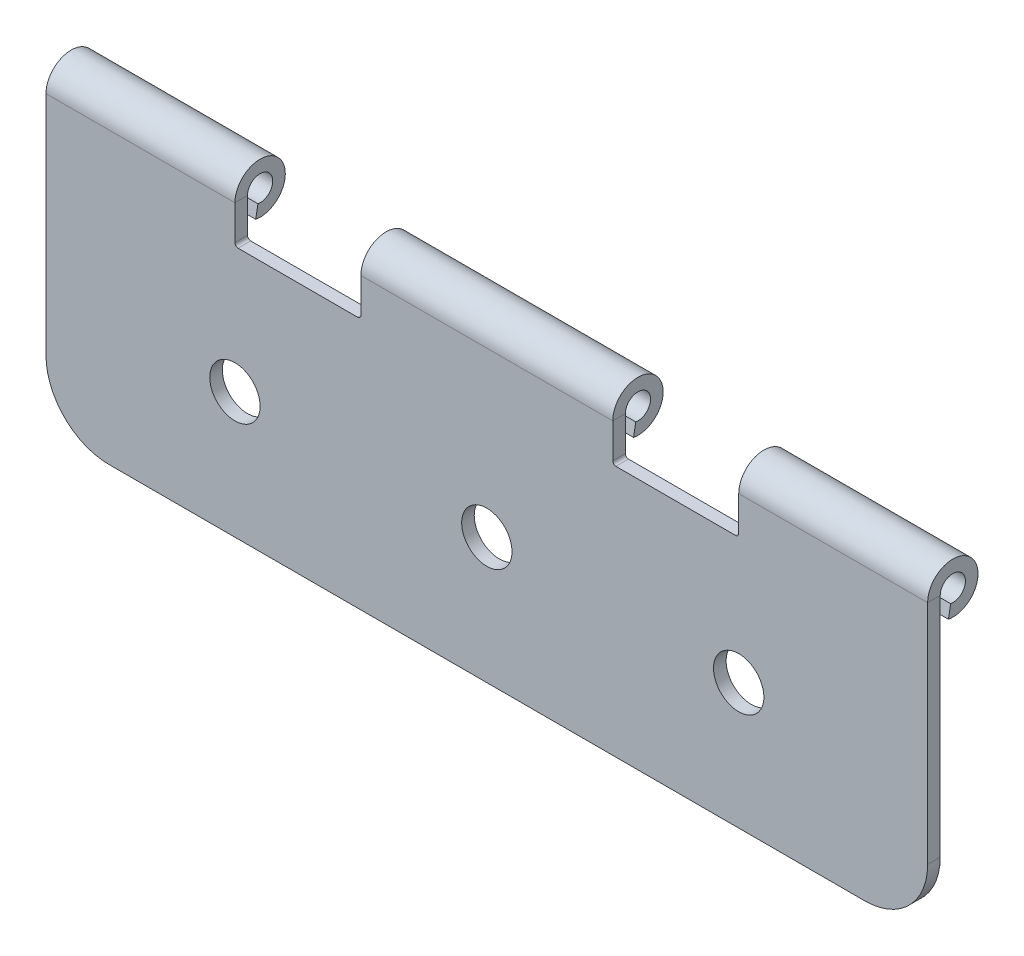
ISO-10303-21;
HEADER;
FILE_DESCRIPTION(('STEP AP214'),'2;1');
FILE_NAME('part.step','',(''),(''),'','','');
FILE_SCHEMA(('AUTOMOTIVE_DESIGN { 1 0 10303 214 1 1 1 1 }'));
ENDSEC;
DATA;
#1=APPLICATION_CONTEXT('core data for automotive mechanical design processes');
#2=APPLICATION_PROTOCOL_DEFINITION('international standard','automotive_design',2000,#1);
#3=PRODUCT_CONTEXT('',#1,'mechanical');
#4=PRODUCT('Part','Part','',(#3));
#5=PRODUCT_RELATED_PRODUCT_CATEGORY('part','',(#4));
#6=PRODUCT_DEFINITION_FORMATION('','',#4);
#7=PRODUCT_DEFINITION_CONTEXT('part definition',#1,'design');
#8=PRODUCT_DEFINITION('design','',#6,#7);
#9=PRODUCT_DEFINITION_SHAPE('','',#8);
#10=(LENGTH_UNIT() NAMED_UNIT(*) SI_UNIT(.MILLI.,.METRE.));
#11=(NAMED_UNIT(*) PLANE_ANGLE_UNIT() SI_UNIT($,.RADIAN.));
#12=(NAMED_UNIT(*) SI_UNIT($,.STERADIAN.) SOLID_ANGLE_UNIT());
#13=UNCERTAINTY_MEASURE_WITH_UNIT(LENGTH_MEASURE(1.E-05),#10,'distance_accuracy_value','');
#14=(GEOMETRIC_REPRESENTATION_CONTEXT(3) GLOBAL_UNCERTAINTY_ASSIGNED_CONTEXT((#13)) GLOBAL_UNIT_ASSIGNED_CONTEXT((#10,
#11,#12)) REPRESENTATION_CONTEXT('',''));
#15=CARTESIAN_POINT('',(0.,0.,0.));
#16=DIRECTION('',(0.,0.,1.));
#17=DIRECTION('',(1.,0.,0.));
#18=AXIS2_PLACEMENT_3D('',#15,#16,#17);
#19=CARTESIAN_POINT('',(15.,25.,-1.));
#20=DIRECTION('',(1.,0.,0.));
#21=DIRECTION('',(0.,0.,-1.));
#22=AXIS2_PLACEMENT_3D('',#19,#20,#21);
#23=PLANE('',#22);
#24=DIRECTION('',(0.,1.,0.));
#25=VECTOR('',#24,1.);
#26=CARTESIAN_POINT('',(15.,25.,0.));
#27=LINE('',#26,#25);
#28=CARTESIAN_POINT('',(15.,20.25,0.));
#29=VERTEX_POINT('',#28);
#30=CARTESIAN_POINT('',(15.,23.,0.));
#31=VERTEX_POINT('',#30);
#32=EDGE_CURVE('E207',#29,#31,#27,.T.);
#33=ORIENTED_EDGE('',*,*,#32,.F.);
#34=DIRECTION('',(0.,0.,1.));
#35=VECTOR('',#34,1.);
#36=CARTESIAN_POINT('',(15.,20.25,-1.));
#37=LINE('',#36,#35);
#38=CARTESIAN_POINT('',(15.,20.25,-1.));
#39=VERTEX_POINT('',#38);
#40=EDGE_CURVE('E396',#29,#39,#37,.F.);
#41=ORIENTED_EDGE('',*,*,#40,.T.);
#42=DIRECTION('',(0.,1.,0.));
#43=VECTOR('',#42,1.);
#44=CARTESIAN_POINT('',(15.,25.,-1.));
#45=LINE('',#44,#43);
#46=CARTESIAN_POINT('',(15.,23.,-1.));
#47=VERTEX_POINT('',#46);
#48=EDGE_CURVE('E342',#39,#47,#45,.T.);
#49=ORIENTED_EDGE('',*,*,#48,.T.);
#50=DIRECTION('',(0.,0.,1.));
#51=VECTOR('',#50,1.);
#52=CARTESIAN_POINT('',(15.,23.,-1.));
#53=LINE('',#52,#51);
#54=EDGE_CURVE('E229',#47,#31,#53,.T.);
#55=ORIENTED_EDGE('',*,*,#54,.T.);
#56=EDGE_LOOP('',(#33,#41,#49,#55));
#57=FACE_BOUND('',#56,.T.);
#58=ADVANCED_FACE('F36',(#57),#23,.T.);
#59=CARTESIAN_POINT('',(45.,25.,-1.));
#60=DIRECTION('',(1.,0.,0.));
#61=DIRECTION('',(0.,0.,-1.));
#62=AXIS2_PLACEMENT_3D('',#59,#60,#61);
#63=PLANE('',#62);
#64=DIRECTION('',(0.,1.,0.));
#65=VECTOR('',#64,1.);
#66=CARTESIAN_POINT('',(45.,25.,0.));
#67=LINE('',#66,#65);
#68=CARTESIAN_POINT('',(45.,20.25,0.));
#69=VERTEX_POINT('',#68);
#70=CARTESIAN_POINT('',(45.,23.,0.));
#71=VERTEX_POINT('',#70);
#72=EDGE_CURVE('E356',#69,#71,#67,.T.);
#73=ORIENTED_EDGE('',*,*,#72,.F.);
#74=DIRECTION('',(0.,0.,1.));
#75=VECTOR('',#74,1.);
#76=CARTESIAN_POINT('',(45.,20.25,-1.));
#77=LINE('',#76,#75);
#78=CARTESIAN_POINT('',(45.,20.25,-1.));
#79=VERTEX_POINT('',#78);
#80=EDGE_CURVE('E378',#69,#79,#77,.F.);
#81=ORIENTED_EDGE('',*,*,#80,.T.);
#82=DIRECTION('',(0.,1.,0.));
#83=VECTOR('',#82,1.);
#84=CARTESIAN_POINT('',(45.,25.,-1.));
#85=LINE('',#84,#83);
#86=CARTESIAN_POINT('',(45.,23.,-1.));
#87=VERTEX_POINT('',#86);
#88=EDGE_CURVE('E334',#79,#87,#85,.T.);
#89=ORIENTED_EDGE('',*,*,#88,.T.);
#90=DIRECTION('',(0.,0.,1.));
#91=VECTOR('',#90,1.);
#92=CARTESIAN_POINT('',(45.,23.,-1.));
#93=LINE('',#92,#91);
#94=EDGE_CURVE('E263',#87,#71,#93,.T.);
#95=ORIENTED_EDGE('',*,*,#94,.T.);
#96=EDGE_LOOP('',(#73,#81,#89,#95));
#97=FACE_BOUND('',#96,.T.);
#98=ADVANCED_FACE('F467',(#97),#63,.T.);
#99=CARTESIAN_POINT('',(70.,25.,-1.));
#100=DIRECTION('',(1.,0.,0.));
#101=DIRECTION('',(0.,0.,-1.));
#102=AXIS2_PLACEMENT_3D('',#99,#100,#101);
#103=PLANE('',#102);
#104=DIRECTION('',(0.,1.,0.));
#105=VECTOR('',#104,1.);
#106=CARTESIAN_POINT('',(70.,25.,0.));
#107=LINE('',#106,#105);
#108=CARTESIAN_POINT('',(70.,4.99999999999999,0.));
#109=VERTEX_POINT('',#108);
#110=CARTESIAN_POINT('',(70.,23.,0.));
#111=VERTEX_POINT('',#110);
#112=EDGE_CURVE('E348',#109,#111,#107,.T.);
#113=ORIENTED_EDGE('',*,*,#112,.F.);
#114=DIRECTION('',(0.,0.,1.));
#115=VECTOR('',#114,1.);
#116=CARTESIAN_POINT('',(70.,4.99999999999999,-1.));
#117=LINE('',#116,#115);
#118=CARTESIAN_POINT('',(70.,4.99999999999999,-1.));
#119=VERTEX_POINT('',#118);
#120=EDGE_CURVE('E59',#109,#119,#117,.F.);
#121=ORIENTED_EDGE('',*,*,#120,.T.);
#122=DIRECTION('',(0.,1.,0.));
#123=VECTOR('',#122,1.);
#124=CARTESIAN_POINT('',(70.,25.,-1.));
#125=LINE('',#124,#123);
#126=CARTESIAN_POINT('',(70.,23.,-0.999999999999994));
#127=VERTEX_POINT('',#126);
#128=EDGE_CURVE('E326',#119,#127,#125,.T.);
#129=ORIENTED_EDGE('',*,*,#128,.T.);
#130=DIRECTION('',(0.,0.,1.));
#131=VECTOR('',#130,1.);
#132=CARTESIAN_POINT('',(70.,23.,-0.999999999999994));
#133=LINE('',#132,#131);
#134=EDGE_CURVE('E297',#127,#111,#133,.T.);
#135=ORIENTED_EDGE('',*,*,#134,.T.);
#136=EDGE_LOOP('',(#113,#121,#129,#135));
#137=FACE_BOUND('',#136,.T.);
#138=ADVANCED_FACE('F429',(#137),#103,.T.);
#139=CARTESIAN_POINT('',(70.,0.,-1.));
#140=DIRECTION('',(0.,-1.,0.));
#141=DIRECTION('',(1.,0.,0.));
#142=AXIS2_PLACEMENT_3D('',#139,#140,#141);
#143=PLANE('',#142);
#144=DIRECTION('',(1.,0.,0.));
#145=VECTOR('',#144,1.);
#146=CARTESIAN_POINT('',(70.,0.,-1.));
#147=LINE('',#146,#145);
#148=CARTESIAN_POINT('',(5.,0.,-1.));
#149=VERTEX_POINT('',#148);
#150=CARTESIAN_POINT('',(65.,0.,-1.));
#151=VERTEX_POINT('',#150);
#152=EDGE_CURVE('E206',#149,#151,#147,.T.);
#153=ORIENTED_EDGE('',*,*,#152,.T.);
#154=DIRECTION('',(0.,0.,1.));
#155=VECTOR('',#154,1.);
#156=CARTESIAN_POINT('',(65.,0.,-1.));
#157=LINE('',#156,#155);
#158=CARTESIAN_POINT('',(65.,0.,0.));
#159=VERTEX_POINT('',#158);
#160=EDGE_CURVE('E411',#151,#159,#157,.T.);
#161=ORIENTED_EDGE('',*,*,#160,.T.);
#162=DIRECTION('',(1.,0.,0.));
#163=VECTOR('',#162,1.);
#164=CARTESIAN_POINT('',(70.,0.,0.));
#165=LINE('',#164,#163);
#166=CARTESIAN_POINT('',(5.,0.,0.));
#167=VERTEX_POINT('',#166);
#168=EDGE_CURVE('E321',#167,#159,#165,.T.);
#169=ORIENTED_EDGE('',*,*,#168,.F.);
#170=DIRECTION('',(0.,0.,1.));
#171=VECTOR('',#170,1.);
#172=CARTESIAN_POINT('',(5.,0.,-1.));
#173=LINE('',#172,#171);
#174=EDGE_CURVE('E409',#167,#149,#173,.F.);
#175=ORIENTED_EDGE('',*,*,#174,.T.);
#176=EDGE_LOOP('',(#153,#161,#169,#175));
#177=FACE_BOUND('',#176,.T.);
#178=ADVANCED_FACE('F425',(#177),#143,.T.);
#179=CARTESIAN_POINT('',(0.,0.,-1.));
#180=DIRECTION('',(-1.,0.,0.));
#181=DIRECTION('',(0.,0.,1.));
#182=AXIS2_PLACEMENT_3D('',#179,#180,#181);
#183=PLANE('',#182);
#184=DIRECTION('',(0.,-1.,0.));
#185=VECTOR('',#184,1.);
#186=CARTESIAN_POINT('',(0.,0.,-1.));
#187=LINE('',#186,#185);
#188=CARTESIAN_POINT('',(0.,23.,-1.));
#189=VERTEX_POINT('',#188);
#190=CARTESIAN_POINT('',(0.,5.,-1.));
#191=VERTEX_POINT('',#190);
#192=EDGE_CURVE('E344',#189,#191,#187,.T.);
#193=ORIENTED_EDGE('',*,*,#192,.T.);
#194=DIRECTION('',(0.,0.,1.));
#195=VECTOR('',#194,1.);
#196=CARTESIAN_POINT('',(0.,5.,-1.));
#197=LINE('',#196,#195);
#198=CARTESIAN_POINT('',(0.,5.,0.));
#199=VERTEX_POINT('',#198);
#200=EDGE_CURVE('E11',#191,#199,#197,.T.);
#201=ORIENTED_EDGE('',*,*,#200,.T.);
#202=DIRECTION('',(0.,-1.,0.));
#203=VECTOR('',#202,1.);
#204=CARTESIAN_POINT('',(0.,0.,0.));
#205=LINE('',#204,#203);
#206=CARTESIAN_POINT('',(0.,23.,0.));
#207=VERTEX_POINT('',#206);
#208=EDGE_CURVE('E199',#207,#199,#205,.T.);
#209=ORIENTED_EDGE('',*,*,#208,.F.);
#210=DIRECTION('',(0.,0.,1.));
#211=VECTOR('',#210,1.);
#212=CARTESIAN_POINT('',(0.,23.,-1.));
#213=LINE('',#212,#211);
#214=EDGE_CURVE('E203',#189,#207,#213,.T.);
#215=ORIENTED_EDGE('',*,*,#214,.F.);
#216=EDGE_LOOP('',(#193,#201,#209,#215));
#217=FACE_BOUND('',#216,.T.);
#218=ADVANCED_FACE('F201',(#217),#183,.T.);
#219=CARTESIAN_POINT('',(15.,20.,-1.));
#220=DIRECTION('',(0.,1.,0.));
#221=DIRECTION('',(0.,0.,1.));
#222=AXIS2_PLACEMENT_3D('',#219,#220,#221);
#223=PLANE('',#222);
#224=DIRECTION('',(-1.,0.,0.));
#225=VECTOR('',#224,1.);
#226=CARTESIAN_POINT('',(15.,20.,-1.));
#227=LINE('',#226,#225);
#228=CARTESIAN_POINT('',(24.75,20.,-1.));
#229=VERTEX_POINT('',#228);
#230=CARTESIAN_POINT('',(15.25,20.,-1.));
#231=VERTEX_POINT('',#230);
#232=EDGE_CURVE('E339',#229,#231,#227,.T.);
#233=ORIENTED_EDGE('',*,*,#232,.T.);
#234=DIRECTION('',(0.,0.,1.));
#235=VECTOR('',#234,1.);
#236=CARTESIAN_POINT('',(15.25,20.,0.));
#237=LINE('',#236,#235);
#238=CARTESIAN_POINT('',(15.25,20.,0.));
#239=VERTEX_POINT('',#238);
#240=EDGE_CURVE('E393',#231,#239,#237,.T.);
#241=ORIENTED_EDGE('',*,*,#240,.T.);
#242=DIRECTION('',(-1.,0.,0.));
#243=VECTOR('',#242,1.);
#244=CARTESIAN_POINT('',(15.,20.,0.));
#245=LINE('',#244,#243);
#246=CARTESIAN_POINT('',(24.75,20.,0.));
#247=VERTEX_POINT('',#246);
#248=EDGE_CURVE('E361',#247,#239,#245,.T.);
#249=ORIENTED_EDGE('',*,*,#248,.F.);
#250=DIRECTION('',(0.,0.,1.));
#251=VECTOR('',#250,1.);
#252=CARTESIAN_POINT('',(24.75,20.,-1.));
#253=LINE('',#252,#251);
#254=EDGE_CURVE('E391',#247,#229,#253,.F.);
#255=ORIENTED_EDGE('',*,*,#254,.T.);
#256=EDGE_LOOP('',(#233,#241,#249,#255));
#257=FACE_BOUND('',#256,.T.);
#258=ADVANCED_FACE('F499',(#257),#223,.T.);
#259=CARTESIAN_POINT('',(25.,20.,-1.));
#260=DIRECTION('',(-1.,0.,0.));
#261=DIRECTION('',(0.,0.,1.));
#262=AXIS2_PLACEMENT_3D('',#259,#260,#261);
#263=PLANE('',#262);
#264=DIRECTION('',(0.,-1.,0.));
#265=VECTOR('',#264,1.);
#266=CARTESIAN_POINT('',(25.,20.,-1.));
#267=LINE('',#266,#265);
#268=CARTESIAN_POINT('',(25.,23.,-1.));
#269=VERTEX_POINT('',#268);
#270=CARTESIAN_POINT('',(25.,20.25,-1.));
#271=VERTEX_POINT('',#270);
#272=EDGE_CURVE('E336',#269,#271,#267,.T.);
#273=ORIENTED_EDGE('',*,*,#272,.T.);
#274=DIRECTION('',(0.,0.,1.));
#275=VECTOR('',#274,1.);
#276=CARTESIAN_POINT('',(25.,20.25,0.));
#277=LINE('',#276,#275);
#278=CARTESIAN_POINT('',(25.,20.25,0.));
#279=VERTEX_POINT('',#278);
#280=EDGE_CURVE('E398',#271,#279,#277,.T.);
#281=ORIENTED_EDGE('',*,*,#280,.T.);
#282=DIRECTION('',(0.,-1.,0.));
#283=VECTOR('',#282,1.);
#284=CARTESIAN_POINT('',(25.,20.,0.));
#285=LINE('',#284,#283);
#286=CARTESIAN_POINT('',(25.,23.,0.));
#287=VERTEX_POINT('',#286);
#288=EDGE_CURVE('E358',#287,#279,#285,.T.);
#289=ORIENTED_EDGE('',*,*,#288,.F.);
#290=DIRECTION('',(0.,0.,1.));
#291=VECTOR('',#290,1.);
#292=CARTESIAN_POINT('',(25.,23.,-1.));
#293=LINE('',#292,#291);
#294=EDGE_CURVE('E280',#269,#287,#293,.T.);
#295=ORIENTED_EDGE('',*,*,#294,.F.);
#296=EDGE_LOOP('',(#273,#281,#289,#295));
#297=FACE_BOUND('',#296,.T.);
#298=ADVANCED_FACE('F490',(#297),#263,.T.);
#299=CARTESIAN_POINT('',(45.,20.,-1.));
#300=DIRECTION('',(0.,1.,0.));
#301=DIRECTION('',(0.,0.,1.));
#302=AXIS2_PLACEMENT_3D('',#299,#300,#301);
#303=PLANE('',#302);
#304=DIRECTION('',(-1.,0.,0.));
#305=VECTOR('',#304,1.);
#306=CARTESIAN_POINT('',(45.,20.,-1.));
#307=LINE('',#306,#305);
#308=CARTESIAN_POINT('',(54.75,20.,-1.));
#309=VERTEX_POINT('',#308);
#310=CARTESIAN_POINT('',(45.25,20.,-1.));
#311=VERTEX_POINT('',#310);
#312=EDGE_CURVE('E331',#309,#311,#307,.T.);
#313=ORIENTED_EDGE('',*,*,#312,.T.);
#314=DIRECTION('',(0.,0.,1.));
#315=VECTOR('',#314,1.);
#316=CARTESIAN_POINT('',(45.25,20.,0.));
#317=LINE('',#316,#315);
#318=CARTESIAN_POINT('',(45.25,20.,0.));
#319=VERTEX_POINT('',#318);
#320=EDGE_CURVE('E375',#311,#319,#317,.T.);
#321=ORIENTED_EDGE('',*,*,#320,.T.);
#322=DIRECTION('',(-1.,0.,0.));
#323=VECTOR('',#322,1.);
#324=CARTESIAN_POINT('',(45.,20.,0.));
#325=LINE('',#324,#323);
#326=CARTESIAN_POINT('',(54.75,20.,0.));
#327=VERTEX_POINT('',#326);
#328=EDGE_CURVE('E353',#327,#319,#325,.T.);
#329=ORIENTED_EDGE('',*,*,#328,.F.);
#330=DIRECTION('',(0.,0.,1.));
#331=VECTOR('',#330,1.);
#332=CARTESIAN_POINT('',(54.75,20.,-1.));
#333=LINE('',#332,#331);
#334=EDGE_CURVE('E346',#327,#309,#333,.F.);
#335=ORIENTED_EDGE('',*,*,#334,.T.);
#336=EDGE_LOOP('',(#313,#321,#329,#335));
#337=FACE_BOUND('',#336,.T.);
#338=ADVANCED_FACE('F459',(#337),#303,.T.);
#339=CARTESIAN_POINT('',(55.,20.,-1.));
#340=DIRECTION('',(-1.,0.,0.));
#341=DIRECTION('',(0.,-1.,0.));
#342=AXIS2_PLACEMENT_3D('',#339,#340,#341);
#343=PLANE('',#342);
#344=DIRECTION('',(0.,-1.,0.));
#345=VECTOR('',#344,1.);
#346=CARTESIAN_POINT('',(55.,20.,-1.));
#347=LINE('',#346,#345);
#348=CARTESIAN_POINT('',(55.,23.,-0.999999999999994));
#349=VERTEX_POINT('',#348);
#350=CARTESIAN_POINT('',(55.,20.25,-1.));
#351=VERTEX_POINT('',#350);
#352=EDGE_CURVE('E328',#349,#351,#347,.T.);
#353=ORIENTED_EDGE('',*,*,#352,.T.);
#354=DIRECTION('',(0.,0.,1.));
#355=VECTOR('',#354,1.);
#356=CARTESIAN_POINT('',(55.,20.25,0.));
#357=LINE('',#356,#355);
#358=CARTESIAN_POINT('',(55.,20.25,0.));
#359=VERTEX_POINT('',#358);
#360=EDGE_CURVE('E380',#351,#359,#357,.T.);
#361=ORIENTED_EDGE('',*,*,#360,.T.);
#362=DIRECTION('',(0.,-1.,0.));
#363=VECTOR('',#362,1.);
#364=CARTESIAN_POINT('',(55.,20.,0.));
#365=LINE('',#364,#363);
#366=CARTESIAN_POINT('',(55.,23.,0.));
#367=VERTEX_POINT('',#366);
#368=EDGE_CURVE('E350',#367,#359,#365,.T.);
#369=ORIENTED_EDGE('',*,*,#368,.F.);
#370=DIRECTION('',(0.,0.,1.));
#371=VECTOR('',#370,1.);
#372=CARTESIAN_POINT('',(55.,23.,-0.999999999999994));
#373=LINE('',#372,#371);
#374=EDGE_CURVE('E314',#349,#367,#373,.T.);
#375=ORIENTED_EDGE('',*,*,#374,.F.);
#376=EDGE_LOOP('',(#353,#361,#369,#375));
#377=FACE_BOUND('',#376,.T.);
#378=ADVANCED_FACE('F450',(#377),#343,.T.);
#379=CARTESIAN_POINT('',(0.,0.,-1.));
#380=DIRECTION('',(0.,0.,-1.));
#381=DIRECTION('',(-1.,0.,0.));
#382=AXIS2_PLACEMENT_3D('',#379,#380,#381);
#383=PLANE('',#382);
#384=CARTESIAN_POINT('',(15.,9.99999999999999,-1.));
#385=DIRECTION('',(0.,0.,-1.));
#386=DIRECTION('',(-1.,0.,0.));
#387=AXIS2_PLACEMENT_3D('',#384,#385,#386);
#388=CIRCLE('',#387,2.);
#389=CARTESIAN_POINT('',(13.,9.99999999999999,-1.));
#390=VERTEX_POINT('',#389);
#391=EDGE_CURVE('E865',#390,#390,#388,.T.);
#392=ORIENTED_EDGE('',*,*,#391,.F.);
#393=EDGE_LOOP('',(#392));
#394=FACE_BOUND('',#393,.T.);
#395=CARTESIAN_POINT('',(55.,10.,-1.));
#396=DIRECTION('',(0.,0.,-1.));
#397=DIRECTION('',(-1.,0.,0.));
#398=AXIS2_PLACEMENT_3D('',#395,#396,#397);
#399=CIRCLE('',#398,2.);
#400=CARTESIAN_POINT('',(53.,10.,-1.));
#401=VERTEX_POINT('',#400);
#402=EDGE_CURVE('E863',#401,#401,#399,.T.);
#403=ORIENTED_EDGE('',*,*,#402,.F.);
#404=EDGE_LOOP('',(#403));
#405=FACE_BOUND('',#404,.T.);
#406=CARTESIAN_POINT('',(35.,9.99999999999999,-1.));
#407=DIRECTION('',(0.,0.,-1.));
#408=DIRECTION('',(-1.,0.,0.));
#409=AXIS2_PLACEMENT_3D('',#406,#407,#408);
#410=CIRCLE('',#409,2.);
#411=CARTESIAN_POINT('',(33.,9.99999999999999,-1.));
#412=VERTEX_POINT('',#411);
#413=EDGE_CURVE('E369',#412,#412,#410,.T.);
#414=ORIENTED_EDGE('',*,*,#413,.F.);
#415=EDGE_LOOP('',(#414));
#416=FACE_BOUND('',#415,.T.);
#417=ORIENTED_EDGE('',*,*,#128,.F.);
#418=CARTESIAN_POINT('',(65.,4.99999999999999,-1.));
#419=DIRECTION('',(0.,0.,-1.));
#420=DIRECTION('',(-1.,0.,0.));
#421=AXIS2_PLACEMENT_3D('',#418,#419,#420);
#422=CIRCLE('',#421,5.);
#423=EDGE_CURVE('E44',#119,#151,#422,.T.);
#424=ORIENTED_EDGE('',*,*,#423,.T.);
#425=ORIENTED_EDGE('',*,*,#152,.F.);
#426=CARTESIAN_POINT('',(5.,5.,-1.));
#427=DIRECTION('',(0.,0.,-1.));
#428=DIRECTION('',(-1.,0.,0.));
#429=AXIS2_PLACEMENT_3D('',#426,#427,#428);
#430=CIRCLE('',#429,5.);
#431=EDGE_CURVE('E51',#149,#191,#430,.T.);
#432=ORIENTED_EDGE('',*,*,#431,.T.);
#433=ORIENTED_EDGE('',*,*,#192,.F.);
#434=DIRECTION('',(1.,0.,0.));
#435=VECTOR('',#434,1.);
#436=CARTESIAN_POINT('',(15.,23.,-1.));
#437=LINE('',#436,#435);
#438=EDGE_CURVE('E242',#47,#189,#437,.F.);
#439=ORIENTED_EDGE('',*,*,#438,.F.);
#440=ORIENTED_EDGE('',*,*,#48,.F.);
#441=CARTESIAN_POINT('',(15.25,20.25,-1.));
#442=DIRECTION('',(0.,0.,-1.));
#443=DIRECTION('',(-1.,0.,0.));
#444=AXIS2_PLACEMENT_3D('',#441,#442,#443);
#445=CIRCLE('',#444,0.25);
#446=EDGE_CURVE('E403',#39,#231,#445,.F.);
#447=ORIENTED_EDGE('',*,*,#446,.T.);
#448=ORIENTED_EDGE('',*,*,#232,.F.);
#449=CARTESIAN_POINT('',(24.75,20.25,-1.));
#450=DIRECTION('',(0.,0.,-1.));
#451=DIRECTION('',(-1.,0.,0.));
#452=AXIS2_PLACEMENT_3D('',#449,#450,#451);
#453=CIRCLE('',#452,0.25);
#454=EDGE_CURVE('E407',#229,#271,#453,.F.);
#455=ORIENTED_EDGE('',*,*,#454,.T.);
#456=ORIENTED_EDGE('',*,*,#272,.F.);
#457=DIRECTION('',(1.,0.,0.));
#458=VECTOR('',#457,1.);
#459=CARTESIAN_POINT('',(45.,23.,-1.));
#460=LINE('',#459,#458);
#461=EDGE_CURVE('E272',#87,#269,#460,.F.);
#462=ORIENTED_EDGE('',*,*,#461,.F.);
#463=ORIENTED_EDGE('',*,*,#88,.F.);
#464=CARTESIAN_POINT('',(45.25,20.25,-1.));
#465=DIRECTION('',(0.,0.,-1.));
#466=DIRECTION('',(-1.,0.,0.));
#467=AXIS2_PLACEMENT_3D('',#464,#465,#466);
#468=CIRCLE('',#467,0.25);
#469=EDGE_CURVE('E385',#79,#311,#468,.F.);
#470=ORIENTED_EDGE('',*,*,#469,.T.);
#471=ORIENTED_EDGE('',*,*,#312,.F.);
#472=CARTESIAN_POINT('',(54.75,20.25,-1.));
#473=DIRECTION('',(0.,0.,-1.));
#474=DIRECTION('',(-1.,0.,0.));
#475=AXIS2_PLACEMENT_3D('',#472,#473,#474);
#476=CIRCLE('',#475,0.25);
#477=EDGE_CURVE('E389',#309,#351,#476,.F.);
#478=ORIENTED_EDGE('',*,*,#477,.T.);
#479=ORIENTED_EDGE('',*,*,#352,.F.);
#480=DIRECTION('',(1.,0.,0.));
#481=VECTOR('',#480,1.);
#482=CARTESIAN_POINT('',(70.,23.,-0.999999999999994));
#483=LINE('',#482,#481);
#484=EDGE_CURVE('E306',#127,#349,#483,.F.);
#485=ORIENTED_EDGE('',*,*,#484,.F.);
#486=EDGE_LOOP('',(#417,#424,#425,#432,#433,#439,#440,#447,#448,#455,#456,#462,#463,#470,#471,
#478,#479,#485));
#487=FACE_BOUND('',#486,.T.);
#488=ADVANCED_FACE('F420',(#394,#405,#416,#487),#383,.T.);
#489=CARTESIAN_POINT('',(0.,0.,0.));
#490=DIRECTION('',(0.,0.,-1.));
#491=DIRECTION('',(-1.,0.,0.));
#492=AXIS2_PLACEMENT_3D('',#489,#490,#491);
#493=PLANE('',#492);
#494=CARTESIAN_POINT('',(15.,9.99999999999999,0.));
#495=DIRECTION('',(0.,0.,-1.));
#496=DIRECTION('',(-1.,0.,0.));
#497=AXIS2_PLACEMENT_3D('',#494,#495,#496);
#498=CIRCLE('',#497,2.);
#499=CARTESIAN_POINT('',(13.,9.99999999999999,0.));
#500=VERTEX_POINT('',#499);
#501=EDGE_CURVE('E250',#500,#500,#498,.T.);
#502=ORIENTED_EDGE('',*,*,#501,.T.);
#503=EDGE_LOOP('',(#502));
#504=FACE_BOUND('',#503,.T.);
#505=CARTESIAN_POINT('',(55.,10.,0.));
#506=DIRECTION('',(0.,0.,-1.));
#507=DIRECTION('',(-1.,0.,0.));
#508=AXIS2_PLACEMENT_3D('',#505,#506,#507);
#509=CIRCLE('',#508,2.);
#510=CARTESIAN_POINT('',(53.,10.,0.));
#511=VERTEX_POINT('',#510);
#512=EDGE_CURVE('E368',#511,#511,#509,.T.);
#513=ORIENTED_EDGE('',*,*,#512,.T.);
#514=EDGE_LOOP('',(#513));
#515=FACE_BOUND('',#514,.T.);
#516=CARTESIAN_POINT('',(35.,9.99999999999999,0.));
#517=DIRECTION('',(0.,0.,-1.));
#518=DIRECTION('',(-1.,0.,0.));
#519=AXIS2_PLACEMENT_3D('',#516,#517,#518);
#520=CIRCLE('',#519,2.);
#521=CARTESIAN_POINT('',(33.,9.99999999999999,0.));
#522=VERTEX_POINT('',#521);
#523=EDGE_CURVE('E365',#522,#522,#520,.T.);
#524=ORIENTED_EDGE('',*,*,#523,.T.);
#525=EDGE_LOOP('',(#524));
#526=FACE_BOUND('',#525,.T.);
#527=ORIENTED_EDGE('',*,*,#168,.T.);
#528=CARTESIAN_POINT('',(65.,4.99999999999999,0.));
#529=DIRECTION('',(0.,0.,-1.));
#530=DIRECTION('',(-1.,0.,0.));
#531=AXIS2_PLACEMENT_3D('',#528,#529,#530);
#532=CIRCLE('',#531,5.);
#533=EDGE_CURVE('E416',#159,#109,#532,.F.);
#534=ORIENTED_EDGE('',*,*,#533,.T.);
#535=ORIENTED_EDGE('',*,*,#112,.T.);
#536=DIRECTION('',(1.,0.,0.));
#537=VECTOR('',#536,1.);
#538=CARTESIAN_POINT('',(70.,23.,0.));
#539=LINE('',#538,#537);
#540=EDGE_CURVE('E290',#111,#367,#539,.F.);
#541=ORIENTED_EDGE('',*,*,#540,.T.);
#542=ORIENTED_EDGE('',*,*,#368,.T.);
#543=CARTESIAN_POINT('',(54.75,20.25,0.));
#544=DIRECTION('',(0.,0.,-1.));
#545=DIRECTION('',(-1.,0.,0.));
#546=AXIS2_PLACEMENT_3D('',#543,#544,#545);
#547=CIRCLE('',#546,0.25);
#548=EDGE_CURVE('E387',#359,#327,#547,.T.);
#549=ORIENTED_EDGE('',*,*,#548,.T.);
#550=ORIENTED_EDGE('',*,*,#328,.T.);
#551=CARTESIAN_POINT('',(45.25,20.25,0.));
#552=DIRECTION('',(0.,0.,-1.));
#553=DIRECTION('',(-1.,0.,0.));
#554=AXIS2_PLACEMENT_3D('',#551,#552,#553);
#555=CIRCLE('',#554,0.25);
#556=EDGE_CURVE('E383',#319,#69,#555,.T.);
#557=ORIENTED_EDGE('',*,*,#556,.T.);
#558=ORIENTED_EDGE('',*,*,#72,.T.);
#559=DIRECTION('',(1.,0.,0.));
#560=VECTOR('',#559,1.);
#561=CARTESIAN_POINT('',(45.,23.,0.));
#562=LINE('',#561,#560);
#563=EDGE_CURVE('E256',#71,#287,#562,.F.);
#564=ORIENTED_EDGE('',*,*,#563,.T.);
#565=ORIENTED_EDGE('',*,*,#288,.T.);
#566=CARTESIAN_POINT('',(24.75,20.25,0.));
#567=DIRECTION('',(0.,0.,-1.));
#568=DIRECTION('',(-1.,0.,0.));
#569=AXIS2_PLACEMENT_3D('',#566,#567,#568);
#570=CIRCLE('',#569,0.25);
#571=EDGE_CURVE('E405',#279,#247,#570,.T.);
#572=ORIENTED_EDGE('',*,*,#571,.T.);
#573=ORIENTED_EDGE('',*,*,#248,.T.);
#574=CARTESIAN_POINT('',(15.25,20.25,0.));
#575=DIRECTION('',(0.,0.,-1.));
#576=DIRECTION('',(-1.,0.,0.));
#577=AXIS2_PLACEMENT_3D('',#574,#575,#576);
#578=CIRCLE('',#577,0.25);
#579=EDGE_CURVE('E401',#239,#29,#578,.T.);
#580=ORIENTED_EDGE('',*,*,#579,.T.);
#581=ORIENTED_EDGE('',*,*,#32,.T.);
#582=DIRECTION('',(1.,0.,0.));
#583=VECTOR('',#582,1.);
#584=CARTESIAN_POINT('',(15.,23.,0.));
#585=LINE('',#584,#583);
#586=EDGE_CURVE('E210',#31,#207,#585,.F.);
#587=ORIENTED_EDGE('',*,*,#586,.T.);
#588=ORIENTED_EDGE('',*,*,#208,.T.);
#589=CARTESIAN_POINT('',(5.,5.,0.));
#590=DIRECTION('',(0.,0.,-1.));
#591=DIRECTION('',(-1.,0.,0.));
#592=AXIS2_PLACEMENT_3D('',#589,#590,#591);
#593=CIRCLE('',#592,5.);
#594=EDGE_CURVE('E414',#199,#167,#593,.F.);
#595=ORIENTED_EDGE('',*,*,#594,.T.);
#596=EDGE_LOOP('',(#527,#534,#535,#541,#542,#549,#550,#557,#558,#564,#565,#572,#573,#580,#581,
#587,#588,#595));
#597=FACE_BOUND('',#596,.T.);
#598=ADVANCED_FACE('F212',(#504,#515,#526,#597),#493,.F.);
#599=CARTESIAN_POINT('',(62.5,22.0151922469878,-1.82635182233306));
#600=DIRECTION('',(0.,-0.173648177666943,-0.984807753012206));
#601=DIRECTION('',(1.,0.,0.));
#602=AXIS2_PLACEMENT_3D('',#599,#600,#601);
#603=PLANE('',#602);
#604=DIRECTION('',(0.,-0.984807753012206,0.173648177666943));
#605=VECTOR('',#604,1.);
#606=CARTESIAN_POINT('',(70.,22.0151922469878,-1.82635182233306));
#607=LINE('',#606,#605);
#608=CARTESIAN_POINT('',(70.,22.0151922469878,-1.82635182233306));
#609=VERTEX_POINT('',#608);
#610=CARTESIAN_POINT('',(70.,21.0303844939756,-1.65270364466611));
#611=VERTEX_POINT('',#610);
#612=EDGE_CURVE('E319',#609,#611,#607,.T.);
#613=ORIENTED_EDGE('',*,*,#612,.F.);
#614=DIRECTION('',(1.,0.,0.));
#615=VECTOR('',#614,1.);
#616=CARTESIAN_POINT('',(70.,22.0151922469878,-1.82635182233306));
#617=LINE('',#616,#615);
#618=CARTESIAN_POINT('',(55.,22.0151922469878,-1.82635182233306));
#619=VERTEX_POINT('',#618);
#620=EDGE_CURVE('E287',#619,#609,#617,.T.);
#621=ORIENTED_EDGE('',*,*,#620,.F.);
#622=DIRECTION('',(0.,-0.984807753012206,0.173648177666943));
#623=VECTOR('',#622,1.);
#624=CARTESIAN_POINT('',(55.,22.0151922469878,-1.82635182233306));
#625=LINE('',#624,#623);
#626=CARTESIAN_POINT('',(55.,21.0303844939756,-1.65270364466611));
#627=VERTEX_POINT('',#626);
#628=EDGE_CURVE('E317',#619,#627,#625,.T.);
#629=ORIENTED_EDGE('',*,*,#628,.T.);
#630=DIRECTION('',(1.,0.,0.));
#631=VECTOR('',#630,1.);
#632=CARTESIAN_POINT('',(70.,21.0303844939756,-1.65270364466611));
#633=LINE('',#632,#631);
#634=EDGE_CURVE('E298',#627,#611,#633,.T.);
#635=ORIENTED_EDGE('',*,*,#634,.T.);
#636=EDGE_LOOP('',(#613,#621,#629,#635));
#637=FACE_BOUND('',#636,.T.);
#638=ADVANCED_FACE('F442',(#637),#603,.F.);
#639=CARTESIAN_POINT('',(55.,23.,-2.));
#640=DIRECTION('',(-1.,0.,0.));
#641=DIRECTION('',(0.,0.,1.));
#642=AXIS2_PLACEMENT_3D('',#639,#640,#641);
#643=PLANE('',#642);
#644=ORIENTED_EDGE('',*,*,#628,.F.);
#645=CARTESIAN_POINT('',(55.,23.,-2.));
#646=DIRECTION('',(1.,0.,0.));
#647=DIRECTION('',(0.,0.,-1.));
#648=AXIS2_PLACEMENT_3D('',#645,#646,#647);
#649=CIRCLE('',#648,1.00000000000001);
#650=EDGE_CURVE('E301',#349,#619,#649,.F.);
#651=ORIENTED_EDGE('',*,*,#650,.F.);
#652=ORIENTED_EDGE('',*,*,#374,.T.);
#653=CARTESIAN_POINT('',(55.,23.,-2.));
#654=DIRECTION('',(1.,0.,0.));
#655=DIRECTION('',(0.,0.,-1.));
#656=AXIS2_PLACEMENT_3D('',#653,#654,#655);
#657=CIRCLE('',#656,2.00000000000001);
#658=EDGE_CURVE('E293',#367,#627,#657,.F.);
#659=ORIENTED_EDGE('',*,*,#658,.T.);
#660=EDGE_LOOP('',(#644,#651,#652,#659));
#661=FACE_BOUND('',#660,.T.);
#662=ADVANCED_FACE('F447',(#661),#643,.T.);
#663=CARTESIAN_POINT('',(70.,23.,-2.));
#664=DIRECTION('',(-1.,0.,0.));
#665=DIRECTION('',(0.,0.,1.));
#666=AXIS2_PLACEMENT_3D('',#663,#664,#665);
#667=PLANE('',#666);
#668=CARTESIAN_POINT('',(70.,23.,-2.));
#669=DIRECTION('',(1.,0.,0.));
#670=DIRECTION('',(0.,0.,-1.));
#671=AXIS2_PLACEMENT_3D('',#668,#669,#670);
#672=CIRCLE('',#671,1.00000000000001);
#673=EDGE_CURVE('E309',#609,#127,#672,.T.);
#674=ORIENTED_EDGE('',*,*,#673,.F.);
#675=ORIENTED_EDGE('',*,*,#612,.T.);
#676=CARTESIAN_POINT('',(70.,23.,-2.));
#677=DIRECTION('',(1.,0.,0.));
#678=DIRECTION('',(0.,0.,-1.));
#679=AXIS2_PLACEMENT_3D('',#676,#677,#678);
#680=CIRCLE('',#679,2.00000000000001);
#681=EDGE_CURVE('E294',#611,#111,#680,.T.);
#682=ORIENTED_EDGE('',*,*,#681,.T.);
#683=ORIENTED_EDGE('',*,*,#134,.F.);
#684=EDGE_LOOP('',(#674,#675,#682,#683));
#685=FACE_BOUND('',#684,.T.);
#686=ADVANCED_FACE('F439',(#685),#667,.F.);
#687=CARTESIAN_POINT('',(70.,23.,-2.));
#688=DIRECTION('',(1.,0.,0.));
#689=DIRECTION('',(0.,-0.984807753012206,0.173648177666943));
#690=AXIS2_PLACEMENT_3D('',#687,#688,#689);
#691=CYLINDRICAL_SURFACE('',#690,2.00000000000001);
#692=ORIENTED_EDGE('',*,*,#540,.F.);
#693=ORIENTED_EDGE('',*,*,#681,.F.);
#694=ORIENTED_EDGE('',*,*,#634,.F.);
#695=ORIENTED_EDGE('',*,*,#658,.F.);
#696=EDGE_LOOP('',(#692,#693,#694,#695));
#697=FACE_BOUND('',#696,.T.);
#698=ADVANCED_FACE('F437',(#697),#691,.T.);
#699=CARTESIAN_POINT('',(70.,23.,-2.));
#700=DIRECTION('',(1.,0.,0.));
#701=DIRECTION('',(0.,-0.984807753012206,0.173648177666943));
#702=AXIS2_PLACEMENT_3D('',#699,#700,#701);
#703=CYLINDRICAL_SURFACE('',#702,1.00000000000001);
#704=ORIENTED_EDGE('',*,*,#484,.T.);
#705=ORIENTED_EDGE('',*,*,#650,.T.);
#706=ORIENTED_EDGE('',*,*,#620,.T.);
#707=ORIENTED_EDGE('',*,*,#673,.T.);
#708=EDGE_LOOP('',(#704,#705,#706,#707));
#709=FACE_BOUND('',#708,.T.);
#710=ADVANCED_FACE('F444',(#709),#703,.F.);
#711=CARTESIAN_POINT('',(35.,22.0151922469878,-1.82635182233306));
#712=DIRECTION('',(0.,-0.173648177666943,-0.984807753012206));
#713=DIRECTION('',(1.,0.,0.));
#714=AXIS2_PLACEMENT_3D('',#711,#712,#713);
#715=PLANE('',#714);
#716=DIRECTION('',(0.,-0.984807753012206,0.173648177666943));
#717=VECTOR('',#716,1.);
#718=CARTESIAN_POINT('',(45.,22.0151922469878,-1.82635182233306));
#719=LINE('',#718,#717);
#720=CARTESIAN_POINT('',(45.,22.0151922469878,-1.82635182233306));
#721=VERTEX_POINT('',#720);
#722=CARTESIAN_POINT('',(45.,21.0303844939756,-1.65270364466611));
#723=VERTEX_POINT('',#722);
#724=EDGE_CURVE('E285',#721,#723,#719,.T.);
#725=ORIENTED_EDGE('',*,*,#724,.F.);
#726=DIRECTION('',(1.,0.,0.));
#727=VECTOR('',#726,1.);
#728=CARTESIAN_POINT('',(45.,22.0151922469878,-1.82635182233306));
#729=LINE('',#728,#727);
#730=CARTESIAN_POINT('',(25.,22.0151922469878,-1.82635182233306));
#731=VERTEX_POINT('',#730);
#732=EDGE_CURVE('E254',#731,#721,#729,.T.);
#733=ORIENTED_EDGE('',*,*,#732,.F.);
#734=DIRECTION('',(0.,-0.984807753012206,0.173648177666943));
#735=VECTOR('',#734,1.);
#736=CARTESIAN_POINT('',(25.,22.0151922469878,-1.82635182233306));
#737=LINE('',#736,#735);
#738=CARTESIAN_POINT('',(25.,21.0303844939756,-1.65270364466611));
#739=VERTEX_POINT('',#738);
#740=EDGE_CURVE('E283',#731,#739,#737,.T.);
#741=ORIENTED_EDGE('',*,*,#740,.T.);
#742=DIRECTION('',(1.,0.,0.));
#743=VECTOR('',#742,1.);
#744=CARTESIAN_POINT('',(45.,21.0303844939756,-1.65270364466611));
#745=LINE('',#744,#743);
#746=EDGE_CURVE('E264',#739,#723,#745,.T.);
#747=ORIENTED_EDGE('',*,*,#746,.T.);
#748=EDGE_LOOP('',(#725,#733,#741,#747));
#749=FACE_BOUND('',#748,.T.);
#750=ADVANCED_FACE('F482',(#749),#715,.F.);
#751=CARTESIAN_POINT('',(25.,23.,-2.));
#752=DIRECTION('',(-1.,0.,0.));
#753=DIRECTION('',(0.,0.,1.));
#754=AXIS2_PLACEMENT_3D('',#751,#752,#753);
#755=PLANE('',#754);
#756=ORIENTED_EDGE('',*,*,#740,.F.);
#757=CARTESIAN_POINT('',(25.,23.,-2.));
#758=DIRECTION('',(1.,0.,0.));
#759=DIRECTION('',(0.,0.,-1.));
#760=AXIS2_PLACEMENT_3D('',#757,#758,#759);
#761=CIRCLE('',#760,1.);
#762=EDGE_CURVE('E267',#269,#731,#761,.F.);
#763=ORIENTED_EDGE('',*,*,#762,.F.);
#764=ORIENTED_EDGE('',*,*,#294,.T.);
#765=CARTESIAN_POINT('',(25.,23.,-2.));
#766=DIRECTION('',(1.,0.,0.));
#767=DIRECTION('',(0.,0.,-1.));
#768=AXIS2_PLACEMENT_3D('',#765,#766,#767);
#769=CIRCLE('',#768,2.);
#770=EDGE_CURVE('E259',#287,#739,#769,.F.);
#771=ORIENTED_EDGE('',*,*,#770,.T.);
#772=EDGE_LOOP('',(#756,#763,#764,#771));
#773=FACE_BOUND('',#772,.T.);
#774=ADVANCED_FACE('F487',(#773),#755,.T.);
#775=CARTESIAN_POINT('',(45.,23.,-2.));
#776=DIRECTION('',(-1.,0.,0.));
#777=DIRECTION('',(0.,0.,1.));
#778=AXIS2_PLACEMENT_3D('',#775,#776,#777);
#779=PLANE('',#778);
#780=CARTESIAN_POINT('',(45.,23.,-2.));
#781=DIRECTION('',(1.,0.,0.));
#782=DIRECTION('',(0.,0.,-1.));
#783=AXIS2_PLACEMENT_3D('',#780,#781,#782);
#784=CIRCLE('',#783,1.);
#785=EDGE_CURVE('E275',#721,#87,#784,.T.);
#786=ORIENTED_EDGE('',*,*,#785,.F.);
#787=ORIENTED_EDGE('',*,*,#724,.T.);
#788=CARTESIAN_POINT('',(45.,23.,-2.));
#789=DIRECTION('',(1.,0.,0.));
#790=DIRECTION('',(0.,0.,-1.));
#791=AXIS2_PLACEMENT_3D('',#788,#789,#790);
#792=CIRCLE('',#791,2.);
#793=EDGE_CURVE('E260',#723,#71,#792,.T.);
#794=ORIENTED_EDGE('',*,*,#793,.T.);
#795=ORIENTED_EDGE('',*,*,#94,.F.);
#796=EDGE_LOOP('',(#786,#787,#794,#795));
#797=FACE_BOUND('',#796,.T.);
#798=ADVANCED_FACE('F479',(#797),#779,.F.);
#799=CARTESIAN_POINT('',(45.,23.,-2.));
#800=DIRECTION('',(1.,0.,0.));
#801=DIRECTION('',(0.,-0.984807753012206,0.173648177666943));
#802=AXIS2_PLACEMENT_3D('',#799,#800,#801);
#803=CYLINDRICAL_SURFACE('',#802,2.);
#804=ORIENTED_EDGE('',*,*,#563,.F.);
#805=ORIENTED_EDGE('',*,*,#793,.F.);
#806=ORIENTED_EDGE('',*,*,#746,.F.);
#807=ORIENTED_EDGE('',*,*,#770,.F.);
#808=EDGE_LOOP('',(#804,#805,#806,#807));
#809=FACE_BOUND('',#808,.T.);
#810=ADVANCED_FACE('F477',(#809),#803,.T.);
#811=CARTESIAN_POINT('',(45.,23.,-2.));
#812=DIRECTION('',(1.,0.,0.));
#813=DIRECTION('',(0.,-0.984807753012206,0.173648177666943));
#814=AXIS2_PLACEMENT_3D('',#811,#812,#813);
#815=CYLINDRICAL_SURFACE('',#814,1.);
#816=ORIENTED_EDGE('',*,*,#461,.T.);
#817=ORIENTED_EDGE('',*,*,#762,.T.);
#818=ORIENTED_EDGE('',*,*,#732,.T.);
#819=ORIENTED_EDGE('',*,*,#785,.T.);
#820=EDGE_LOOP('',(#816,#817,#818,#819));
#821=FACE_BOUND('',#820,.T.);
#822=ADVANCED_FACE('F484',(#821),#815,.F.);
#823=CARTESIAN_POINT('',(7.5,22.0151922469878,-1.82635182233306));
#824=DIRECTION('',(0.,-0.173648177666943,-0.984807753012206));
#825=DIRECTION('',(1.,0.,0.));
#826=AXIS2_PLACEMENT_3D('',#823,#824,#825);
#827=PLANE('',#826);
#828=DIRECTION('',(0.,-0.984807753012206,0.173648177666943));
#829=VECTOR('',#828,1.);
#830=CARTESIAN_POINT('',(15.,22.0151922469878,-1.82635182233306));
#831=LINE('',#830,#829);
#832=CARTESIAN_POINT('',(15.,22.0151922469878,-1.82635182233306));
#833=VERTEX_POINT('',#832);
#834=CARTESIAN_POINT('',(15.,21.0303844939756,-1.65270364466611));
#835=VERTEX_POINT('',#834);
#836=EDGE_CURVE('E253',#833,#835,#831,.T.);
#837=ORIENTED_EDGE('',*,*,#836,.F.);
#838=DIRECTION('',(1.,0.,0.));
#839=VECTOR('',#838,1.);
#840=CARTESIAN_POINT('',(15.,22.0151922469878,-1.82635182233306));
#841=LINE('',#840,#839);
#842=CARTESIAN_POINT('',(0.,22.0151922469878,-1.82635182233306));
#843=VERTEX_POINT('',#842);
#844=EDGE_CURVE('E248',#843,#833,#841,.T.);
#845=ORIENTED_EDGE('',*,*,#844,.F.);
#846=DIRECTION('',(0.,-0.984807753012206,0.173648177666943));
#847=VECTOR('',#846,1.);
#848=CARTESIAN_POINT('',(0.,22.0151922469878,-1.82635182233306));
#849=LINE('',#848,#847);
#850=CARTESIAN_POINT('',(0.,21.0303844939756,-1.65270364466611));
#851=VERTEX_POINT('',#850);
#852=EDGE_CURVE('E228',#843,#851,#849,.T.);
#853=ORIENTED_EDGE('',*,*,#852,.T.);
#854=DIRECTION('',(1.,0.,0.));
#855=VECTOR('',#854,1.);
#856=CARTESIAN_POINT('',(15.,21.0303844939756,-1.65270364466611));
#857=LINE('',#856,#855);
#858=EDGE_CURVE('E234',#851,#835,#857,.T.);
#859=ORIENTED_EDGE('',*,*,#858,.T.);
#860=EDGE_LOOP('',(#837,#845,#853,#859));
#861=FACE_BOUND('',#860,.T.);
#862=ADVANCED_FACE('F516',(#861),#827,.F.);
#863=CARTESIAN_POINT('',(0.,23.,-2.));
#864=DIRECTION('',(-1.,0.,0.));
#865=DIRECTION('',(0.,0.,1.));
#866=AXIS2_PLACEMENT_3D('',#863,#864,#865);
#867=PLANE('',#866);
#868=ORIENTED_EDGE('',*,*,#852,.F.);
#869=CARTESIAN_POINT('',(0.,23.,-2.));
#870=DIRECTION('',(1.,0.,0.));
#871=DIRECTION('',(0.,0.,-1.));
#872=AXIS2_PLACEMENT_3D('',#869,#870,#871);
#873=CIRCLE('',#872,1.);
#874=EDGE_CURVE('E227',#189,#843,#873,.F.);
#875=ORIENTED_EDGE('',*,*,#874,.F.);
#876=ORIENTED_EDGE('',*,*,#214,.T.);
#877=CARTESIAN_POINT('',(0.,23.,-2.));
#878=DIRECTION('',(1.,0.,0.));
#879=DIRECTION('',(0.,0.,-1.));
#880=AXIS2_PLACEMENT_3D('',#877,#878,#879);
#881=CIRCLE('',#880,2.);
#882=EDGE_CURVE('E219',#207,#851,#881,.F.);
#883=ORIENTED_EDGE('',*,*,#882,.T.);
#884=EDGE_LOOP('',(#868,#875,#876,#883));
#885=FACE_BOUND('',#884,.T.);
#886=ADVANCED_FACE('F225',(#885),#867,.T.);
#887=CARTESIAN_POINT('',(15.,23.,-2.));
#888=DIRECTION('',(-1.,0.,0.));
#889=DIRECTION('',(0.,0.,1.));
#890=AXIS2_PLACEMENT_3D('',#887,#888,#889);
#891=PLANE('',#890);
#892=CARTESIAN_POINT('',(15.,23.,-2.));
#893=DIRECTION('',(1.,0.,0.));
#894=DIRECTION('',(0.,0.,-1.));
#895=AXIS2_PLACEMENT_3D('',#892,#893,#894);
#896=CIRCLE('',#895,1.);
#897=EDGE_CURVE('E245',#833,#47,#896,.T.);
#898=ORIENTED_EDGE('',*,*,#897,.F.);
#899=ORIENTED_EDGE('',*,*,#836,.T.);
#900=CARTESIAN_POINT('',(15.,23.,-2.));
#901=DIRECTION('',(1.,0.,0.));
#902=DIRECTION('',(0.,0.,-1.));
#903=AXIS2_PLACEMENT_3D('',#900,#901,#902);
#904=CIRCLE('',#903,2.);
#905=EDGE_CURVE('E220',#835,#31,#904,.T.);
#906=ORIENTED_EDGE('',*,*,#905,.T.);
#907=ORIENTED_EDGE('',*,*,#54,.F.);
#908=EDGE_LOOP('',(#898,#899,#906,#907));
#909=FACE_BOUND('',#908,.T.);
#910=ADVANCED_FACE('F511',(#909),#891,.F.);
#911=CARTESIAN_POINT('',(15.,23.,-2.));
#912=DIRECTION('',(1.,0.,0.));
#913=DIRECTION('',(0.,-0.984807753012206,0.173648177666943));
#914=AXIS2_PLACEMENT_3D('',#911,#912,#913);
#915=CYLINDRICAL_SURFACE('',#914,2.);
#916=ORIENTED_EDGE('',*,*,#586,.F.);
#917=ORIENTED_EDGE('',*,*,#905,.F.);
#918=ORIENTED_EDGE('',*,*,#858,.F.);
#919=ORIENTED_EDGE('',*,*,#882,.F.);
#920=EDGE_LOOP('',(#916,#917,#918,#919));
#921=FACE_BOUND('',#920,.T.);
#922=ADVANCED_FACE('F232',(#921),#915,.T.);
#923=CARTESIAN_POINT('',(15.,23.,-2.));
#924=DIRECTION('',(1.,0.,0.));
#925=DIRECTION('',(0.,-0.984807753012206,0.173648177666943));
#926=AXIS2_PLACEMENT_3D('',#923,#924,#925);
#927=CYLINDRICAL_SURFACE('',#926,1.);
#928=ORIENTED_EDGE('',*,*,#438,.T.);
#929=ORIENTED_EDGE('',*,*,#874,.T.);
#930=ORIENTED_EDGE('',*,*,#844,.T.);
#931=ORIENTED_EDGE('',*,*,#897,.T.);
#932=EDGE_LOOP('',(#928,#929,#930,#931));
#933=FACE_BOUND('',#932,.T.);
#934=ADVANCED_FACE('F513',(#933),#927,.F.);
#935=CARTESIAN_POINT('',(35.,9.99999999999999,9.));
#936=DIRECTION('',(0.,0.,-1.));
#937=DIRECTION('',(-1.,0.,0.));
#938=AXIS2_PLACEMENT_3D('',#935,#936,#937);
#939=CYLINDRICAL_SURFACE('',#938,2.);
#940=ORIENTED_EDGE('',*,*,#413,.T.);
#941=EDGE_LOOP('',(#940));
#942=FACE_BOUND('',#941,.T.);
#943=ORIENTED_EDGE('',*,*,#523,.F.);
#944=EDGE_LOOP('',(#943));
#945=FACE_BOUND('',#944,.T.);
#946=ADVANCED_FACE('F695',(#942,#945),#939,.F.);
#947=CARTESIAN_POINT('',(55.,10.,9.));
#948=DIRECTION('',(0.,0.,-1.));
#949=DIRECTION('',(-1.,0.,0.));
#950=AXIS2_PLACEMENT_3D('',#947,#948,#949);
#951=CYLINDRICAL_SURFACE('',#950,2.);
#952=ORIENTED_EDGE('',*,*,#402,.T.);
#953=EDGE_LOOP('',(#952));
#954=FACE_BOUND('',#953,.T.);
#955=ORIENTED_EDGE('',*,*,#512,.F.);
#956=EDGE_LOOP('',(#955));
#957=FACE_BOUND('',#956,.T.);
#958=ADVANCED_FACE('F684',(#954,#957),#951,.F.);
#959=CARTESIAN_POINT('',(15.,9.99999999999999,9.));
#960=DIRECTION('',(0.,0.,-1.));
#961=DIRECTION('',(-1.,0.,0.));
#962=AXIS2_PLACEMENT_3D('',#959,#960,#961);
#963=CYLINDRICAL_SURFACE('',#962,2.);
#964=ORIENTED_EDGE('',*,*,#391,.T.);
#965=EDGE_LOOP('',(#964));
#966=FACE_BOUND('',#965,.T.);
#967=ORIENTED_EDGE('',*,*,#501,.F.);
#968=EDGE_LOOP('',(#967));
#969=FACE_BOUND('',#968,.T.);
#970=ADVANCED_FACE('F549',(#966,#969),#963,.F.);
#971=CARTESIAN_POINT('',(45.25,20.25,-1.));
#972=DIRECTION('',(0.,0.,-1.));
#973=DIRECTION('',(-1.,0.,0.));
#974=AXIS2_PLACEMENT_3D('',#971,#972,#973);
#975=CYLINDRICAL_SURFACE('',#974,0.25);
#976=ORIENTED_EDGE('',*,*,#469,.F.);
#977=ORIENTED_EDGE('',*,*,#80,.F.);
#978=ORIENTED_EDGE('',*,*,#556,.F.);
#979=ORIENTED_EDGE('',*,*,#320,.F.);
#980=EDGE_LOOP('',(#976,#977,#978,#979));
#981=FACE_BOUND('',#980,.T.);
#982=ADVANCED_FACE('F463',(#981),#975,.F.);
#983=CARTESIAN_POINT('',(54.75,20.25,-1.));
#984=DIRECTION('',(0.,0.,-1.));
#985=DIRECTION('',(-1.,0.,0.));
#986=AXIS2_PLACEMENT_3D('',#983,#984,#985);
#987=CYLINDRICAL_SURFACE('',#986,0.25);
#988=ORIENTED_EDGE('',*,*,#477,.F.);
#989=ORIENTED_EDGE('',*,*,#334,.F.);
#990=ORIENTED_EDGE('',*,*,#548,.F.);
#991=ORIENTED_EDGE('',*,*,#360,.F.);
#992=EDGE_LOOP('',(#988,#989,#990,#991));
#993=FACE_BOUND('',#992,.T.);
#994=ADVANCED_FACE('F456',(#993),#987,.F.);
#995=CARTESIAN_POINT('',(15.25,20.25,-1.));
#996=DIRECTION('',(0.,0.,-1.));
#997=DIRECTION('',(-1.,0.,0.));
#998=AXIS2_PLACEMENT_3D('',#995,#996,#997);
#999=CYLINDRICAL_SURFACE('',#998,0.25);
#1000=ORIENTED_EDGE('',*,*,#446,.F.);
#1001=ORIENTED_EDGE('',*,*,#40,.F.);
#1002=ORIENTED_EDGE('',*,*,#579,.F.);
#1003=ORIENTED_EDGE('',*,*,#240,.F.);
#1004=EDGE_LOOP('',(#1000,#1001,#1002,#1003));
#1005=FACE_BOUND('',#1004,.T.);
#1006=ADVANCED_FACE('F503',(#1005),#999,.F.);
#1007=CARTESIAN_POINT('',(24.75,20.25,-1.));
#1008=DIRECTION('',(0.,0.,-1.));
#1009=DIRECTION('',(-1.,0.,0.));
#1010=AXIS2_PLACEMENT_3D('',#1007,#1008,#1009);
#1011=CYLINDRICAL_SURFACE('',#1010,0.25);
#1012=ORIENTED_EDGE('',*,*,#454,.F.);
#1013=ORIENTED_EDGE('',*,*,#254,.F.);
#1014=ORIENTED_EDGE('',*,*,#571,.F.);
#1015=ORIENTED_EDGE('',*,*,#280,.F.);
#1016=EDGE_LOOP('',(#1012,#1013,#1014,#1015));
#1017=FACE_BOUND('',#1016,.T.);
#1018=ADVANCED_FACE('F496',(#1017),#1011,.F.);
#1019=CARTESIAN_POINT('',(65.,4.99999999999999,-1.));
#1020=DIRECTION('',(0.,0.,1.));
#1021=DIRECTION('',(1.,0.,0.));
#1022=AXIS2_PLACEMENT_3D('',#1019,#1020,#1021);
#1023=CYLINDRICAL_SURFACE('',#1022,5.);
#1024=ORIENTED_EDGE('',*,*,#423,.F.);
#1025=ORIENTED_EDGE('',*,*,#120,.F.);
#1026=ORIENTED_EDGE('',*,*,#533,.F.);
#1027=ORIENTED_EDGE('',*,*,#160,.F.);
#1028=EDGE_LOOP('',(#1024,#1025,#1026,#1027));
#1029=FACE_BOUND('',#1028,.T.);
#1030=ADVANCED_FACE('F428',(#1029),#1023,.T.);
#1031=CARTESIAN_POINT('',(5.,5.,-1.));
#1032=DIRECTION('',(0.,0.,1.));
#1033=DIRECTION('',(1.,0.,0.));
#1034=AXIS2_PLACEMENT_3D('',#1031,#1032,#1033);
#1035=CYLINDRICAL_SURFACE('',#1034,5.);
#1036=ORIENTED_EDGE('',*,*,#431,.F.);
#1037=ORIENTED_EDGE('',*,*,#174,.F.);
#1038=ORIENTED_EDGE('',*,*,#594,.F.);
#1039=ORIENTED_EDGE('',*,*,#200,.F.);
#1040=EDGE_LOOP('',(#1036,#1037,#1038,#1039));
#1041=FACE_BOUND('',#1040,.T.);
#1042=ADVANCED_FACE('F38',(#1041),#1035,.T.);
#1043=CLOSED_SHELL('',(#58,#98,#138,#178,#218,#258,#298,#338,#378,#488,#598,#638,#662,#686,#698,
#710,#750,#774,#798,#810,#822,#862,#886,#910,#922,#934,#946,#958,#970,#982,#994,#1006,#1018,
#1030,#1042));
#1044=MANIFOLD_SOLID_BREP('B2',#1043);
#1045=ADVANCED_BREP_SHAPE_REPRESENTATION('',(#18,#1044),#14);
#1046=SHAPE_DEFINITION_REPRESENTATION(#9,#1045);
ENDSEC;
END-ISO-10303-21;
